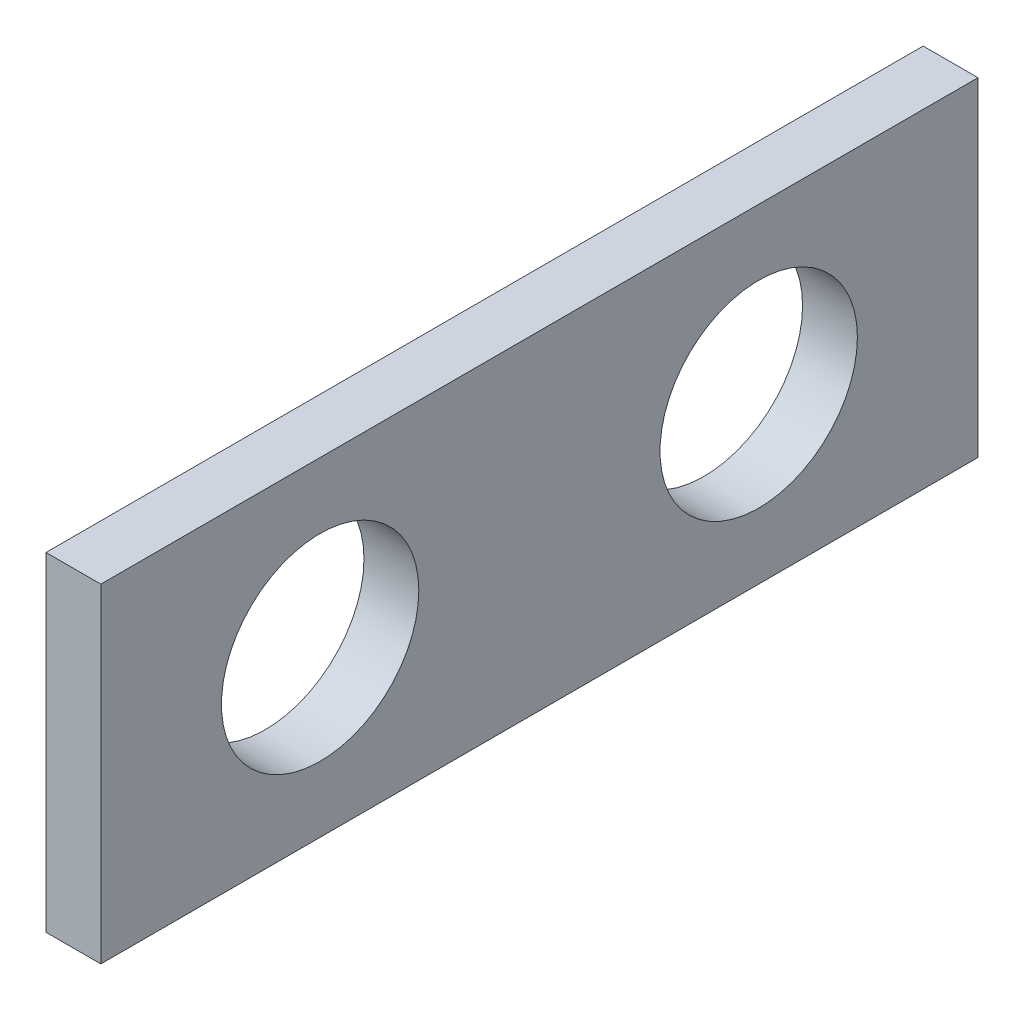
ISO-10303-21;
HEADER;
FILE_DESCRIPTION(('STEP AP214'),'2;1');
FILE_NAME('part.step','',(''),(''),'','','');
FILE_SCHEMA(('AUTOMOTIVE_DESIGN { 1 0 10303 214 1 1 1 1 }'));
ENDSEC;
DATA;
#1=APPLICATION_CONTEXT('core data for automotive mechanical design processes');
#2=APPLICATION_PROTOCOL_DEFINITION('international standard','automotive_design',2000,#1);
#3=PRODUCT_CONTEXT('',#1,'mechanical');
#4=PRODUCT('Part','Part','',(#3));
#5=PRODUCT_RELATED_PRODUCT_CATEGORY('part','',(#4));
#6=PRODUCT_DEFINITION_FORMATION('','',#4);
#7=PRODUCT_DEFINITION_CONTEXT('part definition',#1,'design');
#8=PRODUCT_DEFINITION('design','',#6,#7);
#9=PRODUCT_DEFINITION_SHAPE('','',#8);
#10=(LENGTH_UNIT() NAMED_UNIT(*) SI_UNIT(.MILLI.,.METRE.));
#11=(NAMED_UNIT(*) PLANE_ANGLE_UNIT() SI_UNIT($,.RADIAN.));
#12=(NAMED_UNIT(*) SI_UNIT($,.STERADIAN.) SOLID_ANGLE_UNIT());
#13=UNCERTAINTY_MEASURE_WITH_UNIT(LENGTH_MEASURE(1.E-05),#10,'distance_accuracy_value','');
#14=(GEOMETRIC_REPRESENTATION_CONTEXT(3) GLOBAL_UNCERTAINTY_ASSIGNED_CONTEXT((#13)) GLOBAL_UNIT_ASSIGNED_CONTEXT((#10,
#11,#12)) REPRESENTATION_CONTEXT('',''));
#15=CARTESIAN_POINT('',(0.,0.,0.));
#16=DIRECTION('',(0.,0.,1.));
#17=DIRECTION('',(1.,0.,0.));
#18=AXIS2_PLACEMENT_3D('',#15,#16,#17);
#19=CARTESIAN_POINT('',(5.,-15.,-40.));
#20=DIRECTION('',(0.,0.,1.));
#21=DIRECTION('',(1.,0.,0.));
#22=AXIS2_PLACEMENT_3D('',#19,#20,#21);
#23=PLANE('',#22);
#24=DIRECTION('',(0.,1.,0.));
#25=VECTOR('',#24,1.);
#26=CARTESIAN_POINT('',(0.,-15.,-40.));
#27=LINE('',#26,#25);
#28=CARTESIAN_POINT('',(0.,-15.,-40.));
#29=VERTEX_POINT('',#28);
#30=CARTESIAN_POINT('',(0.,15.,-40.));
#31=VERTEX_POINT('',#30);
#32=EDGE_CURVE('E96',#29,#31,#27,.T.);
#33=ORIENTED_EDGE('',*,*,#32,.T.);
#34=DIRECTION('',(-1.,0.,0.));
#35=VECTOR('',#34,1.);
#36=CARTESIAN_POINT('',(5.,15.,-40.));
#37=LINE('',#36,#35);
#38=CARTESIAN_POINT('',(5.,15.,-40.));
#39=VERTEX_POINT('',#38);
#40=EDGE_CURVE('E11',#39,#31,#37,.T.);
#41=ORIENTED_EDGE('',*,*,#40,.F.);
#42=DIRECTION('',(0.,1.,0.));
#43=VECTOR('',#42,1.);
#44=CARTESIAN_POINT('',(5.,-15.,-40.));
#45=LINE('',#44,#43);
#46=CARTESIAN_POINT('',(5.,-15.,-40.));
#47=VERTEX_POINT('',#46);
#48=EDGE_CURVE('E84',#47,#39,#45,.T.);
#49=ORIENTED_EDGE('',*,*,#48,.F.);
#50=DIRECTION('',(-1.,0.,0.));
#51=VECTOR('',#50,1.);
#52=CARTESIAN_POINT('',(5.,-15.,-40.));
#53=LINE('',#52,#51);
#54=EDGE_CURVE('E92',#47,#29,#53,.T.);
#55=ORIENTED_EDGE('',*,*,#54,.T.);
#56=EDGE_LOOP('',(#33,#41,#49,#55));
#57=FACE_BOUND('',#56,.T.);
#58=ADVANCED_FACE('F33',(#57),#23,.F.);
#59=CARTESIAN_POINT('',(5.,15.,40.));
#60=DIRECTION('',(0.,-1.,0.));
#61=DIRECTION('',(0.,0.,-1.));
#62=AXIS2_PLACEMENT_3D('',#59,#60,#61);
#63=PLANE('',#62);
#64=DIRECTION('',(0.,0.,1.));
#65=VECTOR('',#64,1.);
#66=CARTESIAN_POINT('',(0.,15.,40.));
#67=LINE('',#66,#65);
#68=CARTESIAN_POINT('',(0.,15.,40.));
#69=VERTEX_POINT('',#68);
#70=EDGE_CURVE('E88',#31,#69,#67,.T.);
#71=ORIENTED_EDGE('',*,*,#70,.T.);
#72=DIRECTION('',(-1.,0.,0.));
#73=VECTOR('',#72,1.);
#74=CARTESIAN_POINT('',(5.,15.,40.));
#75=LINE('',#74,#73);
#76=CARTESIAN_POINT('',(5.,15.,40.));
#77=VERTEX_POINT('',#76);
#78=EDGE_CURVE('E41',#77,#69,#75,.T.);
#79=ORIENTED_EDGE('',*,*,#78,.F.);
#80=DIRECTION('',(0.,0.,1.));
#81=VECTOR('',#80,1.);
#82=CARTESIAN_POINT('',(5.,15.,40.));
#83=LINE('',#82,#81);
#84=EDGE_CURVE('E79',#39,#77,#83,.T.);
#85=ORIENTED_EDGE('',*,*,#84,.F.);
#86=ORIENTED_EDGE('',*,*,#40,.T.);
#87=EDGE_LOOP('',(#71,#79,#85,#86));
#88=FACE_BOUND('',#87,.T.);
#89=ADVANCED_FACE('F87',(#88),#63,.F.);
#90=CARTESIAN_POINT('',(5.,-15.,40.));
#91=DIRECTION('',(0.,0.,-1.));
#92=DIRECTION('',(-1.,0.,0.));
#93=AXIS2_PLACEMENT_3D('',#90,#91,#92);
#94=PLANE('',#93);
#95=DIRECTION('',(0.,-1.,0.));
#96=VECTOR('',#95,1.);
#97=CARTESIAN_POINT('',(0.,-15.,40.));
#98=LINE('',#97,#96);
#99=CARTESIAN_POINT('',(0.,-15.,40.));
#100=VERTEX_POINT('',#99);
#101=EDGE_CURVE('E66',#69,#100,#98,.T.);
#102=ORIENTED_EDGE('',*,*,#101,.T.);
#103=DIRECTION('',(-1.,0.,0.));
#104=VECTOR('',#103,1.);
#105=CARTESIAN_POINT('',(5.,-15.,40.));
#106=LINE('',#105,#104);
#107=CARTESIAN_POINT('',(5.,-15.,40.));
#108=VERTEX_POINT('',#107);
#109=EDGE_CURVE('E89',#108,#100,#106,.T.);
#110=ORIENTED_EDGE('',*,*,#109,.F.);
#111=DIRECTION('',(0.,-1.,0.));
#112=VECTOR('',#111,1.);
#113=CARTESIAN_POINT('',(5.,-15.,40.));
#114=LINE('',#113,#112);
#115=EDGE_CURVE('E82',#77,#108,#114,.T.);
#116=ORIENTED_EDGE('',*,*,#115,.F.);
#117=ORIENTED_EDGE('',*,*,#78,.T.);
#118=EDGE_LOOP('',(#102,#110,#116,#117));
#119=FACE_BOUND('',#118,.T.);
#120=ADVANCED_FACE('F90',(#119),#94,.F.);
#121=CARTESIAN_POINT('',(5.,-15.,40.));
#122=DIRECTION('',(0.,1.,0.));
#123=DIRECTION('',(0.,0.,1.));
#124=AXIS2_PLACEMENT_3D('',#121,#122,#123);
#125=PLANE('',#124);
#126=DIRECTION('',(0.,0.,-1.));
#127=VECTOR('',#126,1.);
#128=CARTESIAN_POINT('',(0.,-15.,40.));
#129=LINE('',#128,#127);
#130=EDGE_CURVE('E72',#100,#29,#129,.T.);
#131=ORIENTED_EDGE('',*,*,#130,.T.);
#132=ORIENTED_EDGE('',*,*,#54,.F.);
#133=DIRECTION('',(0.,0.,-1.));
#134=VECTOR('',#133,1.);
#135=CARTESIAN_POINT('',(5.,-15.,40.));
#136=LINE('',#135,#134);
#137=EDGE_CURVE('E49',#108,#47,#136,.T.);
#138=ORIENTED_EDGE('',*,*,#137,.F.);
#139=ORIENTED_EDGE('',*,*,#109,.T.);
#140=EDGE_LOOP('',(#131,#132,#138,#139));
#141=FACE_BOUND('',#140,.T.);
#142=ADVANCED_FACE('F104',(#141),#125,.F.);
#143=CARTESIAN_POINT('',(5.,0.,0.));
#144=DIRECTION('',(-1.,0.,0.));
#145=DIRECTION('',(0.,0.,1.));
#146=AXIS2_PLACEMENT_3D('',#143,#144,#145);
#147=PLANE('',#146);
#148=CARTESIAN_POINT('',(5.,0.,-20.));
#149=DIRECTION('',(1.,0.,0.));
#150=DIRECTION('',(0.,0.,-1.));
#151=AXIS2_PLACEMENT_3D('',#148,#149,#150);
#152=CIRCLE('',#151,9.00000000000001);
#153=CARTESIAN_POINT('',(5.,0.,-29.));
#154=VERTEX_POINT('',#153);
#155=EDGE_CURVE('E116',#154,#154,#152,.T.);
#156=ORIENTED_EDGE('',*,*,#155,.F.);
#157=EDGE_LOOP('',(#156));
#158=FACE_BOUND('',#157,.T.);
#159=CARTESIAN_POINT('',(5.,0.,20.));
#160=DIRECTION('',(1.,0.,0.));
#161=DIRECTION('',(0.,0.,-1.));
#162=AXIS2_PLACEMENT_3D('',#159,#160,#161);
#163=CIRCLE('',#162,9.);
#164=CARTESIAN_POINT('',(5.,0.,11.));
#165=VERTEX_POINT('',#164);
#166=EDGE_CURVE('E110',#165,#165,#163,.T.);
#167=ORIENTED_EDGE('',*,*,#166,.F.);
#168=EDGE_LOOP('',(#167));
#169=FACE_BOUND('',#168,.T.);
#170=ORIENTED_EDGE('',*,*,#48,.T.);
#171=ORIENTED_EDGE('',*,*,#84,.T.);
#172=ORIENTED_EDGE('',*,*,#115,.T.);
#173=ORIENTED_EDGE('',*,*,#137,.T.);
#174=EDGE_LOOP('',(#170,#171,#172,#173));
#175=FACE_BOUND('',#174,.T.);
#176=ADVANCED_FACE('F80',(#158,#169,#175),#147,.F.);
#177=CARTESIAN_POINT('',(0.,0.,0.));
#178=DIRECTION('',(-1.,0.,0.));
#179=DIRECTION('',(0.,0.,1.));
#180=AXIS2_PLACEMENT_3D('',#177,#178,#179);
#181=PLANE('',#180);
#182=CARTESIAN_POINT('',(0.,0.,-20.));
#183=DIRECTION('',(1.,0.,0.));
#184=DIRECTION('',(0.,0.,-1.));
#185=AXIS2_PLACEMENT_3D('',#182,#183,#184);
#186=CIRCLE('',#185,9.00000000000001);
#187=CARTESIAN_POINT('',(0.,0.,-29.));
#188=VERTEX_POINT('',#187);
#189=EDGE_CURVE('E99',#188,#188,#186,.T.);
#190=ORIENTED_EDGE('',*,*,#189,.T.);
#191=EDGE_LOOP('',(#190));
#192=FACE_BOUND('',#191,.T.);
#193=CARTESIAN_POINT('',(0.,0.,20.));
#194=DIRECTION('',(1.,0.,0.));
#195=DIRECTION('',(0.,0.,-1.));
#196=AXIS2_PLACEMENT_3D('',#193,#194,#195);
#197=CIRCLE('',#196,9.);
#198=CARTESIAN_POINT('',(0.,0.,11.));
#199=VERTEX_POINT('',#198);
#200=EDGE_CURVE('E113',#199,#199,#197,.T.);
#201=ORIENTED_EDGE('',*,*,#200,.T.);
#202=EDGE_LOOP('',(#201));
#203=FACE_BOUND('',#202,.T.);
#204=ORIENTED_EDGE('',*,*,#32,.F.);
#205=ORIENTED_EDGE('',*,*,#130,.F.);
#206=ORIENTED_EDGE('',*,*,#101,.F.);
#207=ORIENTED_EDGE('',*,*,#70,.F.);
#208=EDGE_LOOP('',(#204,#205,#206,#207));
#209=FACE_BOUND('',#208,.T.);
#210=ADVANCED_FACE('F107',(#192,#203,#209),#181,.T.);
#211=CARTESIAN_POINT('',(0.,0.,20.));
#212=DIRECTION('',(1.,0.,0.));
#213=DIRECTION('',(0.,0.,-1.));
#214=AXIS2_PLACEMENT_3D('',#211,#212,#213);
#215=CYLINDRICAL_SURFACE('',#214,9.);
#216=ORIENTED_EDGE('',*,*,#200,.F.);
#217=EDGE_LOOP('',(#216));
#218=FACE_BOUND('',#217,.T.);
#219=ORIENTED_EDGE('',*,*,#166,.T.);
#220=EDGE_LOOP('',(#219));
#221=FACE_BOUND('',#220,.T.);
#222=ADVANCED_FACE('F127',(#218,#221),#215,.F.);
#223=CARTESIAN_POINT('',(0.,0.,-20.));
#224=DIRECTION('',(1.,0.,0.));
#225=DIRECTION('',(0.,0.,-1.));
#226=AXIS2_PLACEMENT_3D('',#223,#224,#225);
#227=CYLINDRICAL_SURFACE('',#226,9.00000000000001);
#228=ORIENTED_EDGE('',*,*,#189,.F.);
#229=EDGE_LOOP('',(#228));
#230=FACE_BOUND('',#229,.T.);
#231=ORIENTED_EDGE('',*,*,#155,.T.);
#232=EDGE_LOOP('',(#231));
#233=FACE_BOUND('',#232,.T.);
#234=ADVANCED_FACE('F124',(#230,#233),#227,.F.);
#235=CLOSED_SHELL('',(#58,#89,#120,#142,#176,#210,#222,#234));
#236=MANIFOLD_SOLID_BREP('B2',#235);
#237=ADVANCED_BREP_SHAPE_REPRESENTATION('',(#18,#236),#14);
#238=SHAPE_DEFINITION_REPRESENTATION(#9,#237);
ENDSEC;
END-ISO-10303-21;
